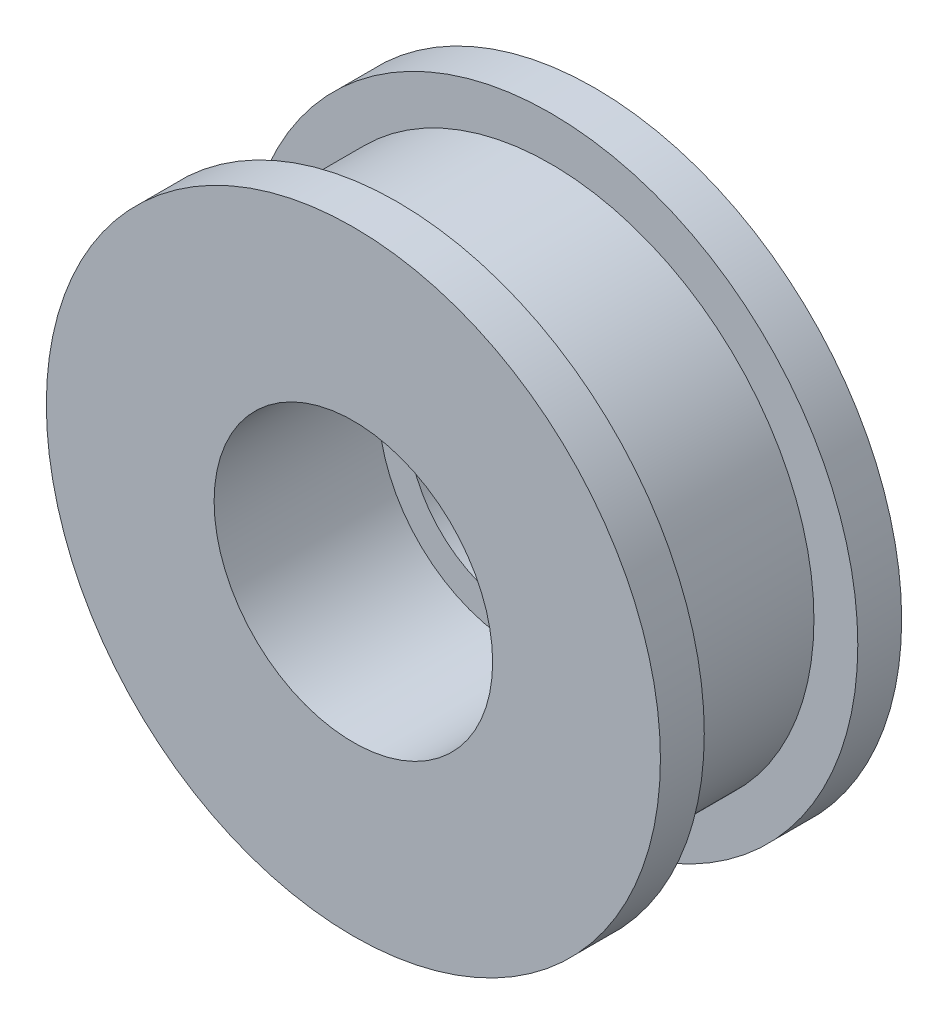
ISO-10303-21;
HEADER;
FILE_DESCRIPTION(('STEP AP214'),'2;1');
FILE_NAME('part.step','',(''),(''),'','','');
FILE_SCHEMA(('AUTOMOTIVE_DESIGN { 1 0 10303 214 1 1 1 1 }'));
ENDSEC;
DATA;
#1=APPLICATION_CONTEXT('core data for automotive mechanical design processes');
#2=APPLICATION_PROTOCOL_DEFINITION('international standard','automotive_design',2000,#1);
#3=PRODUCT_CONTEXT('',#1,'mechanical');
#4=PRODUCT('Part','Part','',(#3));
#5=PRODUCT_RELATED_PRODUCT_CATEGORY('part','',(#4));
#6=PRODUCT_DEFINITION_FORMATION('','',#4);
#7=PRODUCT_DEFINITION_CONTEXT('part definition',#1,'design');
#8=PRODUCT_DEFINITION('design','',#6,#7);
#9=PRODUCT_DEFINITION_SHAPE('','',#8);
#10=(LENGTH_UNIT() NAMED_UNIT(*) SI_UNIT(.MILLI.,.METRE.));
#11=(NAMED_UNIT(*) PLANE_ANGLE_UNIT() SI_UNIT($,.RADIAN.));
#12=(NAMED_UNIT(*) SI_UNIT($,.STERADIAN.) SOLID_ANGLE_UNIT());
#13=UNCERTAINTY_MEASURE_WITH_UNIT(LENGTH_MEASURE(1.E-05),#10,'distance_accuracy_value','');
#14=(GEOMETRIC_REPRESENTATION_CONTEXT(3) GLOBAL_UNCERTAINTY_ASSIGNED_CONTEXT((#13)) GLOBAL_UNIT_ASSIGNED_CONTEXT((#10,
#11,#12)) REPRESENTATION_CONTEXT('',''));
#15=CARTESIAN_POINT('',(0.,0.,0.));
#16=DIRECTION('',(0.,0.,1.));
#17=DIRECTION('',(1.,0.,0.));
#18=AXIS2_PLACEMENT_3D('',#15,#16,#17);
#19=CARTESIAN_POINT('',(0.,0.,2.));
#20=DIRECTION('',(0.,0.,1.));
#21=DIRECTION('',(1.,0.,0.));
#22=AXIS2_PLACEMENT_3D('',#19,#20,#21);
#23=PLANE('',#22);
#24=CARTESIAN_POINT('',(0.,0.,2.));
#25=DIRECTION('',(0.,0.,1.));
#26=DIRECTION('',(1.,0.,0.));
#27=AXIS2_PLACEMENT_3D('',#24,#25,#26);
#28=CIRCLE('',#27,14.);
#29=CARTESIAN_POINT('',(14.,0.,2.));
#30=VERTEX_POINT('',#29);
#31=EDGE_CURVE('E10',#30,#30,#28,.T.);
#32=ORIENTED_EDGE('',*,*,#31,.T.);
#33=EDGE_LOOP('',(#32));
#34=FACE_BOUND('',#33,.T.);
#35=CARTESIAN_POINT('',(0.,0.,2.));
#36=DIRECTION('',(0.,0.,1.));
#37=DIRECTION('',(1.,0.,0.));
#38=AXIS2_PLACEMENT_3D('',#35,#36,#37);
#39=CIRCLE('',#38,12.);
#40=CARTESIAN_POINT('',(12.,0.,2.));
#41=VERTEX_POINT('',#40);
#42=EDGE_CURVE('E45',#41,#41,#39,.F.);
#43=ORIENTED_EDGE('',*,*,#42,.T.);
#44=EDGE_LOOP('',(#43));
#45=FACE_BOUND('',#44,.T.);
#46=ADVANCED_FACE('F32',(#34,#45),#23,.T.);
#47=CARTESIAN_POINT('',(0.,0.,2.));
#48=DIRECTION('',(0.,0.,-1.));
#49=DIRECTION('',(-1.,0.,0.));
#50=AXIS2_PLACEMENT_3D('',#47,#48,#49);
#51=CYLINDRICAL_SURFACE('',#50,14.);
#52=ORIENTED_EDGE('',*,*,#31,.F.);
#53=EDGE_LOOP('',(#52));
#54=FACE_BOUND('',#53,.T.);
#55=CARTESIAN_POINT('',(0.,0.,0.));
#56=DIRECTION('',(0.,0.,1.));
#57=DIRECTION('',(1.,0.,0.));
#58=AXIS2_PLACEMENT_3D('',#55,#56,#57);
#59=CIRCLE('',#58,14.);
#60=CARTESIAN_POINT('',(14.,0.,0.));
#61=VERTEX_POINT('',#60);
#62=EDGE_CURVE('E40',#61,#61,#59,.T.);
#63=ORIENTED_EDGE('',*,*,#62,.T.);
#64=EDGE_LOOP('',(#63));
#65=FACE_BOUND('',#64,.T.);
#66=ADVANCED_FACE('F34',(#54,#65),#51,.T.);
#67=CARTESIAN_POINT('',(0.,0.,0.));
#68=DIRECTION('',(0.,0.,1.));
#69=DIRECTION('',(1.,0.,0.));
#70=AXIS2_PLACEMENT_3D('',#67,#68,#69);
#71=PLANE('',#70);
#72=CARTESIAN_POINT('',(0.,0.,0.));
#73=DIRECTION('',(0.,0.,1.));
#74=DIRECTION('',(1.,0.,0.));
#75=AXIS2_PLACEMENT_3D('',#72,#73,#74);
#76=CIRCLE('',#75,5.);
#77=CARTESIAN_POINT('',(5.,0.,0.));
#78=VERTEX_POINT('',#77);
#79=EDGE_CURVE('E64',#78,#78,#76,.T.);
#80=ORIENTED_EDGE('',*,*,#79,.T.);
#81=EDGE_LOOP('',(#80));
#82=FACE_BOUND('',#81,.T.);
#83=ORIENTED_EDGE('',*,*,#62,.F.);
#84=EDGE_LOOP('',(#83));
#85=FACE_BOUND('',#84,.T.);
#86=ADVANCED_FACE('F106',(#82,#85),#71,.F.);
#87=CARTESIAN_POINT('',(0.,0.,9.));
#88=DIRECTION('',(0.,0.,-1.));
#89=DIRECTION('',(-1.,0.,0.));
#90=AXIS2_PLACEMENT_3D('',#87,#88,#89);
#91=CYLINDRICAL_SURFACE('',#90,12.);
#92=ORIENTED_EDGE('',*,*,#42,.F.);
#93=EDGE_LOOP('',(#92));
#94=FACE_BOUND('',#93,.T.);
#95=CARTESIAN_POINT('',(0.,0.,9.));
#96=DIRECTION('',(0.,0.,1.));
#97=DIRECTION('',(1.,0.,0.));
#98=AXIS2_PLACEMENT_3D('',#95,#96,#97);
#99=CIRCLE('',#98,12.);
#100=CARTESIAN_POINT('',(12.,0.,9.));
#101=VERTEX_POINT('',#100);
#102=EDGE_CURVE('E49',#101,#101,#99,.T.);
#103=ORIENTED_EDGE('',*,*,#102,.F.);
#104=EDGE_LOOP('',(#103));
#105=FACE_BOUND('',#104,.T.);
#106=ADVANCED_FACE('F101',(#94,#105),#91,.T.);
#107=CARTESIAN_POINT('',(0.,0.,9.));
#108=DIRECTION('',(0.,0.,1.));
#109=DIRECTION('',(1.,0.,0.));
#110=AXIS2_PLACEMENT_3D('',#107,#108,#109);
#111=PLANE('',#110);
#112=CARTESIAN_POINT('',(0.,0.,9.));
#113=DIRECTION('',(0.,0.,1.));
#114=DIRECTION('',(1.,0.,0.));
#115=AXIS2_PLACEMENT_3D('',#112,#113,#114);
#116=CIRCLE('',#115,14.);
#117=CARTESIAN_POINT('',(14.,0.,9.));
#118=VERTEX_POINT('',#117);
#119=EDGE_CURVE('E53',#118,#118,#116,.T.);
#120=ORIENTED_EDGE('',*,*,#119,.F.);
#121=EDGE_LOOP('',(#120));
#122=FACE_BOUND('',#121,.T.);
#123=ORIENTED_EDGE('',*,*,#102,.T.);
#124=EDGE_LOOP('',(#123));
#125=FACE_BOUND('',#124,.T.);
#126=ADVANCED_FACE('F95',(#122,#125),#111,.F.);
#127=CARTESIAN_POINT('',(0.,0.,11.));
#128=DIRECTION('',(0.,0.,-1.));
#129=DIRECTION('',(-1.,0.,0.));
#130=AXIS2_PLACEMENT_3D('',#127,#128,#129);
#131=CYLINDRICAL_SURFACE('',#130,14.);
#132=CARTESIAN_POINT('',(0.,0.,11.));
#133=DIRECTION('',(0.,0.,1.));
#134=DIRECTION('',(1.,0.,0.));
#135=AXIS2_PLACEMENT_3D('',#132,#133,#134);
#136=CIRCLE('',#135,14.);
#137=CARTESIAN_POINT('',(14.,0.,11.));
#138=VERTEX_POINT('',#137);
#139=EDGE_CURVE('E52',#138,#138,#136,.T.);
#140=ORIENTED_EDGE('',*,*,#139,.F.);
#141=EDGE_LOOP('',(#140));
#142=FACE_BOUND('',#141,.T.);
#143=ORIENTED_EDGE('',*,*,#119,.T.);
#144=EDGE_LOOP('',(#143));
#145=FACE_BOUND('',#144,.T.);
#146=ADVANCED_FACE('F89',(#142,#145),#131,.T.);
#147=CARTESIAN_POINT('',(0.,0.,11.));
#148=DIRECTION('',(0.,0.,1.));
#149=DIRECTION('',(1.,0.,0.));
#150=AXIS2_PLACEMENT_3D('',#147,#148,#149);
#151=PLANE('',#150);
#152=CARTESIAN_POINT('',(0.,0.,11.));
#153=DIRECTION('',(0.,0.,1.));
#154=DIRECTION('',(1.,0.,0.));
#155=AXIS2_PLACEMENT_3D('',#152,#153,#154);
#156=CIRCLE('',#155,6.35);
#157=CARTESIAN_POINT('',(6.35,0.,11.));
#158=VERTEX_POINT('',#157);
#159=EDGE_CURVE('E59',#158,#158,#156,.T.);
#160=ORIENTED_EDGE('',*,*,#159,.F.);
#161=EDGE_LOOP('',(#160));
#162=FACE_BOUND('',#161,.T.);
#163=ORIENTED_EDGE('',*,*,#139,.T.);
#164=EDGE_LOOP('',(#163));
#165=FACE_BOUND('',#164,.T.);
#166=ADVANCED_FACE('F83',(#162,#165),#151,.T.);
#167=CARTESIAN_POINT('',(0.,0.,3.5));
#168=DIRECTION('',(0.,0.,1.));
#169=DIRECTION('',(1.,0.,0.));
#170=AXIS2_PLACEMENT_3D('',#167,#168,#169);
#171=CYLINDRICAL_SURFACE('',#170,6.35);
#172=CARTESIAN_POINT('',(0.,0.,3.5));
#173=DIRECTION('',(0.,0.,1.));
#174=DIRECTION('',(1.,0.,0.));
#175=AXIS2_PLACEMENT_3D('',#172,#173,#174);
#176=CIRCLE('',#175,6.35);
#177=CARTESIAN_POINT('',(6.35,0.,3.5));
#178=VERTEX_POINT('',#177);
#179=EDGE_CURVE('E56',#178,#178,#176,.T.);
#180=ORIENTED_EDGE('',*,*,#179,.F.);
#181=EDGE_LOOP('',(#180));
#182=FACE_BOUND('',#181,.T.);
#183=ORIENTED_EDGE('',*,*,#159,.T.);
#184=EDGE_LOOP('',(#183));
#185=FACE_BOUND('',#184,.T.);
#186=ADVANCED_FACE('F77',(#182,#185),#171,.F.);
#187=CARTESIAN_POINT('',(0.,0.,3.5));
#188=DIRECTION('',(0.,0.,1.));
#189=DIRECTION('',(1.,0.,0.));
#190=AXIS2_PLACEMENT_3D('',#187,#188,#189);
#191=PLANE('',#190);
#192=CARTESIAN_POINT('',(0.,0.,3.5));
#193=DIRECTION('',(0.,0.,1.));
#194=DIRECTION('',(1.,0.,0.));
#195=AXIS2_PLACEMENT_3D('',#192,#193,#194);
#196=CIRCLE('',#195,5.);
#197=CARTESIAN_POINT('',(5.,0.,3.5));
#198=VERTEX_POINT('',#197);
#199=EDGE_CURVE('E36',#198,#198,#196,.T.);
#200=ORIENTED_EDGE('',*,*,#199,.F.);
#201=EDGE_LOOP('',(#200));
#202=FACE_BOUND('',#201,.T.);
#203=ORIENTED_EDGE('',*,*,#179,.T.);
#204=EDGE_LOOP('',(#203));
#205=FACE_BOUND('',#204,.T.);
#206=ADVANCED_FACE('F74',(#202,#205),#191,.T.);
#207=CARTESIAN_POINT('',(0.,0.,0.));
#208=DIRECTION('',(0.,0.,1.));
#209=DIRECTION('',(1.,0.,0.));
#210=AXIS2_PLACEMENT_3D('',#207,#208,#209);
#211=CYLINDRICAL_SURFACE('',#210,5.);
#212=ORIENTED_EDGE('',*,*,#199,.T.);
#213=EDGE_LOOP('',(#212));
#214=FACE_BOUND('',#213,.T.);
#215=ORIENTED_EDGE('',*,*,#79,.F.);
#216=EDGE_LOOP('',(#215));
#217=FACE_BOUND('',#216,.T.);
#218=ADVANCED_FACE('F71',(#214,#217),#211,.F.);
#219=CLOSED_SHELL('',(#46,#66,#86,#106,#126,#146,#166,#186,#206,#218));
#220=MANIFOLD_SOLID_BREP('B2',#219);
#221=ADVANCED_BREP_SHAPE_REPRESENTATION('',(#18,#220),#14);
#222=SHAPE_DEFINITION_REPRESENTATION(#9,#221);
ENDSEC;
END-ISO-10303-21;
